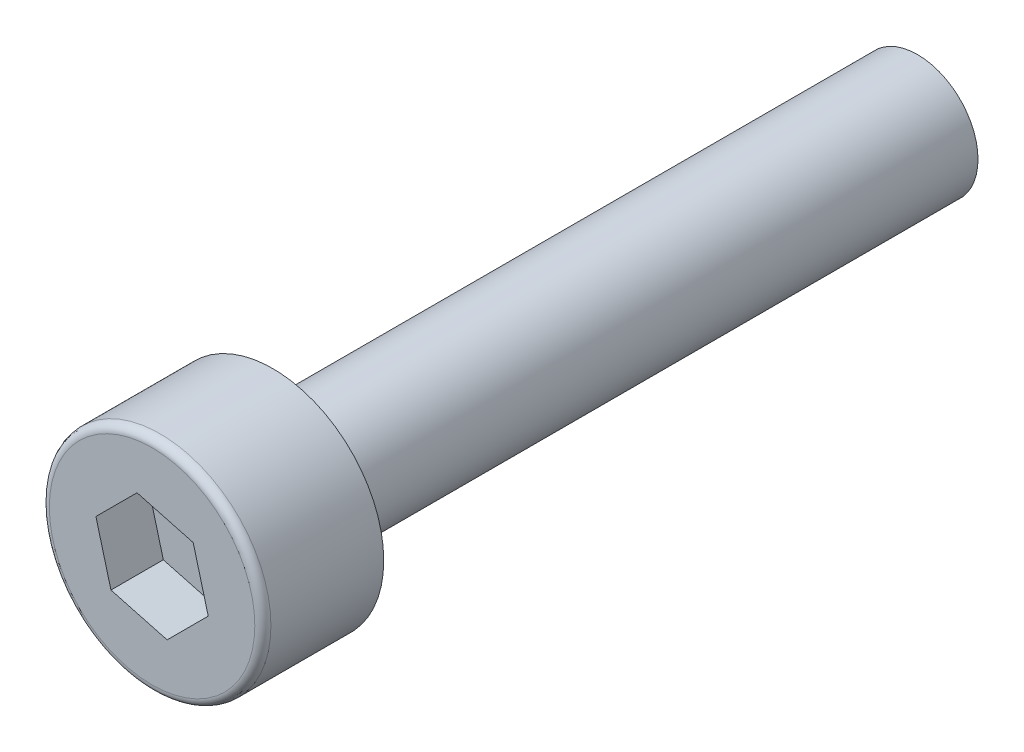
ISO-10303-21;
HEADER;
FILE_DESCRIPTION(('STEP AP214'),'2;1');
FILE_NAME('part.step','',(''),(''),'','','');
FILE_SCHEMA(('AUTOMOTIVE_DESIGN { 1 0 10303 214 1 1 1 1 }'));
ENDSEC;
DATA;
#1=APPLICATION_CONTEXT('core data for automotive mechanical design processes');
#2=APPLICATION_PROTOCOL_DEFINITION('international standard','automotive_design',2000,#1);
#3=PRODUCT_CONTEXT('',#1,'mechanical');
#4=PRODUCT('Part','Part','',(#3));
#5=PRODUCT_RELATED_PRODUCT_CATEGORY('part','',(#4));
#6=PRODUCT_DEFINITION_FORMATION('','',#4);
#7=PRODUCT_DEFINITION_CONTEXT('part definition',#1,'design');
#8=PRODUCT_DEFINITION('design','',#6,#7);
#9=PRODUCT_DEFINITION_SHAPE('','',#8);
#10=(LENGTH_UNIT() NAMED_UNIT(*) SI_UNIT(.MILLI.,.METRE.));
#11=(NAMED_UNIT(*) PLANE_ANGLE_UNIT() SI_UNIT($,.RADIAN.));
#12=(NAMED_UNIT(*) SI_UNIT($,.STERADIAN.) SOLID_ANGLE_UNIT());
#13=UNCERTAINTY_MEASURE_WITH_UNIT(LENGTH_MEASURE(1.E-05),#10,'distance_accuracy_value','');
#14=(GEOMETRIC_REPRESENTATION_CONTEXT(3) GLOBAL_UNCERTAINTY_ASSIGNED_CONTEXT((#13)) GLOBAL_UNIT_ASSIGNED_CONTEXT((#10,
#11,#12)) REPRESENTATION_CONTEXT('',''));
#15=CARTESIAN_POINT('',(0.,0.,0.));
#16=DIRECTION('',(0.,0.,1.));
#17=DIRECTION('',(1.,0.,0.));
#18=AXIS2_PLACEMENT_3D('',#15,#16,#17);
#19=CARTESIAN_POINT('',(0.,0.,0.));
#20=DIRECTION('',(0.,0.,1.));
#21=DIRECTION('',(1.,0.,0.));
#22=AXIS2_PLACEMENT_3D('',#19,#20,#21);
#23=PLANE('',#22);
#24=CARTESIAN_POINT('',(0.,0.,0.));
#25=DIRECTION('',(0.,0.,1.));
#26=DIRECTION('',(1.,0.,0.));
#27=AXIS2_PLACEMENT_3D('',#24,#25,#26);
#28=CIRCLE('',#27,2.75);
#29=CARTESIAN_POINT('',(2.75,0.,0.));
#30=VERTEX_POINT('',#29);
#31=EDGE_CURVE('E137',#30,#30,#28,.T.);
#32=ORIENTED_EDGE('',*,*,#31,.F.);
#33=EDGE_LOOP('',(#32));
#34=FACE_BOUND('',#33,.T.);
#35=CARTESIAN_POINT('',(0.,0.,0.));
#36=DIRECTION('',(0.,0.,1.));
#37=DIRECTION('',(1.,0.,0.));
#38=AXIS2_PLACEMENT_3D('',#35,#36,#37);
#39=CIRCLE('',#38,1.5);
#40=CARTESIAN_POINT('',(1.5,0.,0.));
#41=VERTEX_POINT('',#40);
#42=EDGE_CURVE('E145',#41,#41,#39,.F.);
#43=ORIENTED_EDGE('',*,*,#42,.F.);
#44=EDGE_LOOP('',(#43));
#45=FACE_BOUND('',#44,.T.);
#46=ADVANCED_FACE('F34',(#34,#45),#23,.F.);
#47=CARTESIAN_POINT('',(0.,0.,3.));
#48=DIRECTION('',(0.,0.,-1.));
#49=DIRECTION('',(-1.,0.,0.));
#50=AXIS2_PLACEMENT_3D('',#47,#48,#49);
#51=CYLINDRICAL_SURFACE('',#50,2.75);
#52=CARTESIAN_POINT('',(0.,0.,2.8));
#53=DIRECTION('',(0.,0.,1.));
#54=DIRECTION('',(1.,0.,0.));
#55=AXIS2_PLACEMENT_3D('',#52,#53,#54);
#56=CIRCLE('',#55,2.75);
#57=CARTESIAN_POINT('',(2.75,0.,2.8));
#58=VERTEX_POINT('',#57);
#59=EDGE_CURVE('E11',#58,#58,#56,.F.);
#60=ORIENTED_EDGE('',*,*,#59,.T.);
#61=EDGE_LOOP('',(#60));
#62=FACE_BOUND('',#61,.T.);
#63=ORIENTED_EDGE('',*,*,#31,.T.);
#64=EDGE_LOOP('',(#63));
#65=FACE_BOUND('',#64,.T.);
#66=ADVANCED_FACE('F164',(#62,#65),#51,.T.);
#67=CARTESIAN_POINT('',(0.,0.,3.));
#68=DIRECTION('',(0.,0.,1.));
#69=DIRECTION('',(1.,0.,0.));
#70=AXIS2_PLACEMENT_3D('',#67,#68,#69);
#71=PLANE('',#70);
#72=CARTESIAN_POINT('',(0.,0.,3.));
#73=DIRECTION('',(0.,0.,1.));
#74=DIRECTION('',(1.,0.,0.));
#75=AXIS2_PLACEMENT_3D('',#72,#73,#74);
#76=CIRCLE('',#75,2.55);
#77=CARTESIAN_POINT('',(2.55,0.,3.));
#78=VERTEX_POINT('',#77);
#79=EDGE_CURVE('E42',#78,#78,#76,.T.);
#80=ORIENTED_EDGE('',*,*,#79,.T.);
#81=EDGE_LOOP('',(#80));
#82=FACE_BOUND('',#81,.T.);
#83=DIRECTION('',(0.258819045102521,-0.965925826289068,0.));
#84=VECTOR('',#83,1.);
#85=CARTESIAN_POINT('',(-1.39419383956301,0.373573113403356,3.));
#86=LINE('',#85,#84);
#87=CARTESIAN_POINT('',(-1.39419383956301,0.373573113403356,3.));
#88=VERTEX_POINT('',#87);
#89=CARTESIAN_POINT('',(-1.02062072615966,-1.02062072615966,3.));
#90=VERTEX_POINT('',#89);
#91=EDGE_CURVE('E49',#88,#90,#86,.T.);
#92=ORIENTED_EDGE('',*,*,#91,.F.);
#93=DIRECTION('',(-0.707106781186548,-0.707106781186548,0.));
#94=VECTOR('',#93,1.);
#95=CARTESIAN_POINT('',(-0.373573113403355,1.39419383956301,3.));
#96=LINE('',#95,#94);
#97=CARTESIAN_POINT('',(-0.373573113403355,1.39419383956301,3.));
#98=VERTEX_POINT('',#97);
#99=EDGE_CURVE('E133',#98,#88,#96,.T.);
#100=ORIENTED_EDGE('',*,*,#99,.F.);
#101=DIRECTION('',(-0.965925826289068,0.258819045102521,0.));
#102=VECTOR('',#101,1.);
#103=CARTESIAN_POINT('',(1.02062072615966,1.02062072615966,3.));
#104=LINE('',#103,#102);
#105=CARTESIAN_POINT('',(1.02062072615966,1.02062072615966,3.));
#106=VERTEX_POINT('',#105);
#107=EDGE_CURVE('E131',#106,#98,#104,.T.);
#108=ORIENTED_EDGE('',*,*,#107,.F.);
#109=DIRECTION('',(-0.258819045102521,0.965925826289068,0.));
#110=VECTOR('',#109,1.);
#111=CARTESIAN_POINT('',(1.39419383956301,-0.373573113403355,3.));
#112=LINE('',#111,#110);
#113=CARTESIAN_POINT('',(1.39419383956301,-0.373573113403355,3.));
#114=VERTEX_POINT('',#113);
#115=EDGE_CURVE('E97',#114,#106,#112,.T.);
#116=ORIENTED_EDGE('',*,*,#115,.F.);
#117=DIRECTION('',(0.707106781186548,0.707106781186548,0.));
#118=VECTOR('',#117,1.);
#119=CARTESIAN_POINT('',(0.373573113403355,-1.39419383956301,3.));
#120=LINE('',#119,#118);
#121=CARTESIAN_POINT('',(0.373573113403355,-1.39419383956301,3.));
#122=VERTEX_POINT('',#121);
#123=EDGE_CURVE('E127',#122,#114,#120,.T.);
#124=ORIENTED_EDGE('',*,*,#123,.F.);
#125=DIRECTION('',(0.965925826289068,-0.258819045102521,0.));
#126=VECTOR('',#125,1.);
#127=CARTESIAN_POINT('',(-1.02062072615966,-1.02062072615966,3.));
#128=LINE('',#127,#126);
#129=EDGE_CURVE('E123',#90,#122,#128,.T.);
#130=ORIENTED_EDGE('',*,*,#129,.F.);
#131=EDGE_LOOP('',(#92,#100,#108,#116,#124,#130));
#132=FACE_BOUND('',#131,.T.);
#133=ADVANCED_FACE('F150',(#82,#132),#71,.T.);
#134=CARTESIAN_POINT('',(-1.39419383956301,0.373573113403356,1.7));
#135=DIRECTION('',(-0.965925826289068,-0.258819045102521,0.));
#136=DIRECTION('',(0.258819045102521,-0.965925826289068,0.));
#137=AXIS2_PLACEMENT_3D('',#134,#135,#136);
#138=PLANE('',#137);
#139=ORIENTED_EDGE('',*,*,#91,.T.);
#140=DIRECTION('',(0.,0.,1.));
#141=VECTOR('',#140,1.);
#142=CARTESIAN_POINT('',(-1.02062072615966,-1.02062072615966,1.7));
#143=LINE('',#142,#141);
#144=CARTESIAN_POINT('',(-1.02062072615966,-1.02062072615966,1.7));
#145=VERTEX_POINT('',#144);
#146=EDGE_CURVE('E79',#145,#90,#143,.T.);
#147=ORIENTED_EDGE('',*,*,#146,.F.);
#148=DIRECTION('',(0.258819045102521,-0.965925826289068,0.));
#149=VECTOR('',#148,1.);
#150=CARTESIAN_POINT('',(-1.39419383956301,0.373573113403356,1.7));
#151=LINE('',#150,#149);
#152=CARTESIAN_POINT('',(-1.39419383956301,0.373573113403356,1.7));
#153=VERTEX_POINT('',#152);
#154=EDGE_CURVE('E135',#153,#145,#151,.T.);
#155=ORIENTED_EDGE('',*,*,#154,.F.);
#156=DIRECTION('',(0.,0.,1.));
#157=VECTOR('',#156,1.);
#158=CARTESIAN_POINT('',(-1.39419383956301,0.373573113403356,1.7));
#159=LINE('',#158,#157);
#160=EDGE_CURVE('E57',#153,#88,#159,.T.);
#161=ORIENTED_EDGE('',*,*,#160,.T.);
#162=EDGE_LOOP('',(#139,#147,#155,#161));
#163=FACE_BOUND('',#162,.T.);
#164=ADVANCED_FACE('F176',(#163),#138,.F.);
#165=CARTESIAN_POINT('',(-0.373573113403355,1.39419383956301,1.7));
#166=DIRECTION('',(-0.707106781186548,0.707106781186548,0.));
#167=DIRECTION('',(-0.707106781186548,-0.707106781186548,0.));
#168=AXIS2_PLACEMENT_3D('',#165,#166,#167);
#169=PLANE('',#168);
#170=ORIENTED_EDGE('',*,*,#99,.T.);
#171=ORIENTED_EDGE('',*,*,#160,.F.);
#172=DIRECTION('',(-0.707106781186548,-0.707106781186548,0.));
#173=VECTOR('',#172,1.);
#174=CARTESIAN_POINT('',(-0.373573113403355,1.39419383956301,1.7));
#175=LINE('',#174,#173);
#176=CARTESIAN_POINT('',(-0.373573113403355,1.39419383956301,1.7));
#177=VERTEX_POINT('',#176);
#178=EDGE_CURVE('E109',#177,#153,#175,.T.);
#179=ORIENTED_EDGE('',*,*,#178,.F.);
#180=DIRECTION('',(0.,0.,1.));
#181=VECTOR('',#180,1.);
#182=CARTESIAN_POINT('',(-0.373573113403355,1.39419383956301,1.7));
#183=LINE('',#182,#181);
#184=EDGE_CURVE('E101',#177,#98,#183,.T.);
#185=ORIENTED_EDGE('',*,*,#184,.T.);
#186=EDGE_LOOP('',(#170,#171,#179,#185));
#187=FACE_BOUND('',#186,.T.);
#188=ADVANCED_FACE('F179',(#187),#169,.F.);
#189=CARTESIAN_POINT('',(1.02062072615966,1.02062072615966,1.7));
#190=DIRECTION('',(0.258819045102521,0.965925826289068,0.));
#191=DIRECTION('',(-0.965925826289068,0.258819045102521,0.));
#192=AXIS2_PLACEMENT_3D('',#189,#190,#191);
#193=PLANE('',#192);
#194=ORIENTED_EDGE('',*,*,#107,.T.);
#195=ORIENTED_EDGE('',*,*,#184,.F.);
#196=DIRECTION('',(-0.965925826289068,0.258819045102521,0.));
#197=VECTOR('',#196,1.);
#198=CARTESIAN_POINT('',(1.02062072615966,1.02062072615966,1.7));
#199=LINE('',#198,#197);
#200=CARTESIAN_POINT('',(1.02062072615966,1.02062072615966,1.7));
#201=VERTEX_POINT('',#200);
#202=EDGE_CURVE('E105',#201,#177,#199,.T.);
#203=ORIENTED_EDGE('',*,*,#202,.F.);
#204=DIRECTION('',(0.,0.,1.));
#205=VECTOR('',#204,1.);
#206=CARTESIAN_POINT('',(1.02062072615966,1.02062072615966,1.7));
#207=LINE('',#206,#205);
#208=EDGE_CURVE('E90',#201,#106,#207,.T.);
#209=ORIENTED_EDGE('',*,*,#208,.T.);
#210=EDGE_LOOP('',(#194,#195,#203,#209));
#211=FACE_BOUND('',#210,.T.);
#212=ADVANCED_FACE('F106',(#211),#193,.F.);
#213=CARTESIAN_POINT('',(1.39419383956301,-0.373573113403355,1.7));
#214=DIRECTION('',(0.965925826289068,0.258819045102521,0.));
#215=DIRECTION('',(-0.258819045102521,0.965925826289068,0.));
#216=AXIS2_PLACEMENT_3D('',#213,#214,#215);
#217=PLANE('',#216);
#218=ORIENTED_EDGE('',*,*,#115,.T.);
#219=ORIENTED_EDGE('',*,*,#208,.F.);
#220=DIRECTION('',(-0.258819045102521,0.965925826289068,0.));
#221=VECTOR('',#220,1.);
#222=CARTESIAN_POINT('',(1.39419383956301,-0.373573113403355,1.7));
#223=LINE('',#222,#221);
#224=CARTESIAN_POINT('',(1.39419383956301,-0.373573113403355,1.7));
#225=VERTEX_POINT('',#224);
#226=EDGE_CURVE('E94',#225,#201,#223,.T.);
#227=ORIENTED_EDGE('',*,*,#226,.F.);
#228=DIRECTION('',(0.,0.,1.));
#229=VECTOR('',#228,1.);
#230=CARTESIAN_POINT('',(1.39419383956301,-0.373573113403355,1.7));
#231=LINE('',#230,#229);
#232=EDGE_CURVE('E102',#225,#114,#231,.T.);
#233=ORIENTED_EDGE('',*,*,#232,.T.);
#234=EDGE_LOOP('',(#218,#219,#227,#233));
#235=FACE_BOUND('',#234,.T.);
#236=ADVANCED_FACE('F92',(#235),#217,.F.);
#237=CARTESIAN_POINT('',(0.373573113403355,-1.39419383956301,1.7));
#238=DIRECTION('',(0.707106781186548,-0.707106781186548,0.));
#239=DIRECTION('',(0.707106781186548,0.707106781186548,0.));
#240=AXIS2_PLACEMENT_3D('',#237,#238,#239);
#241=PLANE('',#240);
#242=ORIENTED_EDGE('',*,*,#123,.T.);
#243=ORIENTED_EDGE('',*,*,#232,.F.);
#244=DIRECTION('',(0.707106781186548,0.707106781186548,0.));
#245=VECTOR('',#244,1.);
#246=CARTESIAN_POINT('',(0.373573113403355,-1.39419383956301,1.7));
#247=LINE('',#246,#245);
#248=CARTESIAN_POINT('',(0.373573113403355,-1.39419383956301,1.7));
#249=VERTEX_POINT('',#248);
#250=EDGE_CURVE('E115',#249,#225,#247,.T.);
#251=ORIENTED_EDGE('',*,*,#250,.F.);
#252=DIRECTION('',(0.,0.,1.));
#253=VECTOR('',#252,1.);
#254=CARTESIAN_POINT('',(0.373573113403355,-1.39419383956301,1.7));
#255=LINE('',#254,#253);
#256=EDGE_CURVE('E140',#249,#122,#255,.T.);
#257=ORIENTED_EDGE('',*,*,#256,.T.);
#258=EDGE_LOOP('',(#242,#243,#251,#257));
#259=FACE_BOUND('',#258,.T.);
#260=ADVANCED_FACE('F183',(#259),#241,.F.);
#261=CARTESIAN_POINT('',(-1.02062072615966,-1.02062072615966,1.7));
#262=DIRECTION('',(-0.258819045102521,-0.965925826289068,0.));
#263=DIRECTION('',(0.965925826289068,-0.258819045102521,0.));
#264=AXIS2_PLACEMENT_3D('',#261,#262,#263);
#265=PLANE('',#264);
#266=ORIENTED_EDGE('',*,*,#129,.T.);
#267=ORIENTED_EDGE('',*,*,#256,.F.);
#268=DIRECTION('',(0.965925826289068,-0.258819045102521,0.));
#269=VECTOR('',#268,1.);
#270=CARTESIAN_POINT('',(-1.02062072615966,-1.02062072615966,1.7));
#271=LINE('',#270,#269);
#272=EDGE_CURVE('E117',#145,#249,#271,.T.);
#273=ORIENTED_EDGE('',*,*,#272,.F.);
#274=ORIENTED_EDGE('',*,*,#146,.T.);
#275=EDGE_LOOP('',(#266,#267,#273,#274));
#276=FACE_BOUND('',#275,.T.);
#277=ADVANCED_FACE('F180',(#276),#265,.F.);
#278=CARTESIAN_POINT('',(0.,0.,1.7));
#279=DIRECTION('',(0.,0.,1.));
#280=DIRECTION('',(1.,0.,0.));
#281=AXIS2_PLACEMENT_3D('',#278,#279,#280);
#282=PLANE('',#281);
#283=ORIENTED_EDGE('',*,*,#154,.T.);
#284=ORIENTED_EDGE('',*,*,#272,.T.);
#285=ORIENTED_EDGE('',*,*,#250,.T.);
#286=ORIENTED_EDGE('',*,*,#226,.T.);
#287=ORIENTED_EDGE('',*,*,#202,.T.);
#288=ORIENTED_EDGE('',*,*,#178,.T.);
#289=EDGE_LOOP('',(#283,#284,#285,#286,#287,#288));
#290=FACE_BOUND('',#289,.T.);
#291=ADVANCED_FACE('F112',(#290),#282,.T.);
#292=CARTESIAN_POINT('',(0.,0.,-16.));
#293=DIRECTION('',(0.,0.,1.));
#294=DIRECTION('',(1.,0.,0.));
#295=AXIS2_PLACEMENT_3D('',#292,#293,#294);
#296=CYLINDRICAL_SURFACE('',#295,1.5);
#297=CARTESIAN_POINT('',(0.,0.,-16.));
#298=DIRECTION('',(0.,0.,-1.));
#299=DIRECTION('',(-1.,0.,0.));
#300=AXIS2_PLACEMENT_3D('',#297,#298,#299);
#301=CIRCLE('',#300,1.5);
#302=CARTESIAN_POINT('',(-1.5,0.,-16.));
#303=VERTEX_POINT('',#302);
#304=EDGE_CURVE('E124',#303,#303,#301,.T.);
#305=ORIENTED_EDGE('',*,*,#304,.F.);
#306=EDGE_LOOP('',(#305));
#307=FACE_BOUND('',#306,.T.);
#308=ORIENTED_EDGE('',*,*,#42,.T.);
#309=EDGE_LOOP('',(#308));
#310=FACE_BOUND('',#309,.T.);
#311=ADVANCED_FACE('F159',(#307,#310),#296,.T.);
#312=CARTESIAN_POINT('',(0.,0.,-16.));
#313=DIRECTION('',(0.,0.,-1.));
#314=DIRECTION('',(-1.,0.,0.));
#315=AXIS2_PLACEMENT_3D('',#312,#313,#314);
#316=PLANE('',#315);
#317=ORIENTED_EDGE('',*,*,#304,.T.);
#318=EDGE_LOOP('',(#317));
#319=FACE_BOUND('',#318,.T.);
#320=ADVANCED_FACE('F154',(#319),#316,.T.);
#321=CARTESIAN_POINT('',(0.,0.,2.8));
#322=DIRECTION('',(0.,0.,1.));
#323=DIRECTION('',(1.,0.,0.));
#324=AXIS2_PLACEMENT_3D('',#321,#322,#323);
#325=TOROIDAL_SURFACE('',#324,2.55,0.2);
#326=ORIENTED_EDGE('',*,*,#59,.F.);
#327=EDGE_LOOP('',(#326));
#328=FACE_BOUND('',#327,.T.);
#329=ORIENTED_EDGE('',*,*,#79,.F.);
#330=EDGE_LOOP('',(#329));
#331=FACE_BOUND('',#330,.T.);
#332=ADVANCED_FACE('F36',(#328,#331),#325,.T.);
#333=CLOSED_SHELL('',(#46,#66,#133,#164,#188,#212,#236,#260,#277,#291,#311,#320,#332));
#334=MANIFOLD_SOLID_BREP('B2',#333);
#335=ADVANCED_BREP_SHAPE_REPRESENTATION('',(#18,#334),#14);
#336=SHAPE_DEFINITION_REPRESENTATION(#9,#335);
ENDSEC;
END-ISO-10303-21;
